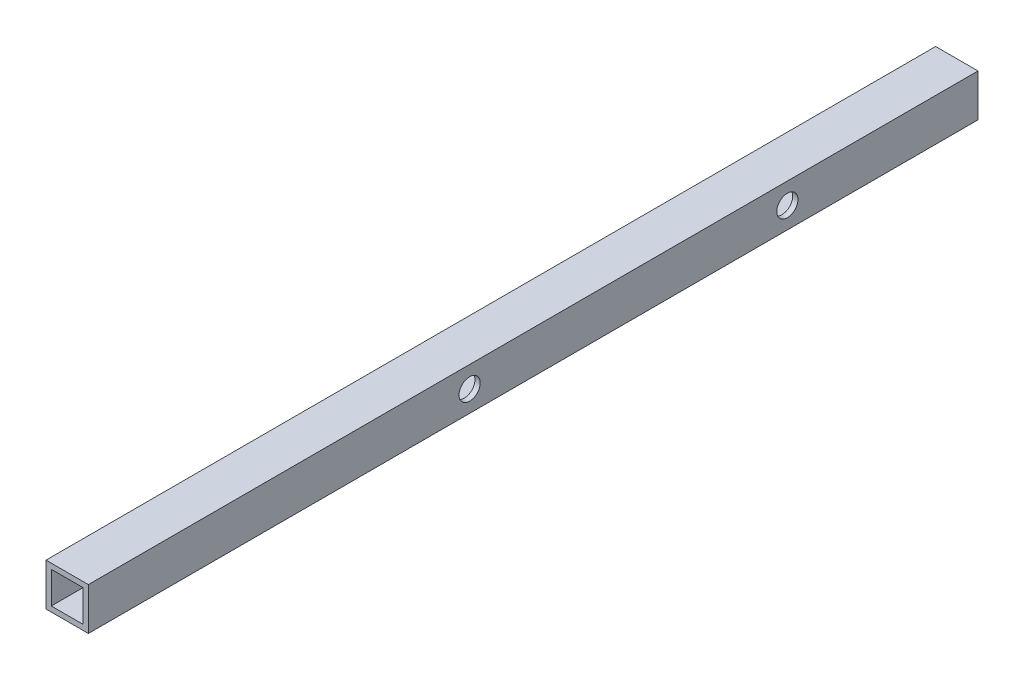
ISO-10303-21;
HEADER;
FILE_DESCRIPTION(('STEP AP214'),'2;1');
FILE_NAME('part.step','',(''),(''),'','','');
FILE_SCHEMA(('AUTOMOTIVE_DESIGN { 1 0 10303 214 1 1 1 1 }'));
ENDSEC;
DATA;
#1=APPLICATION_CONTEXT('core data for automotive mechanical design processes');
#2=APPLICATION_PROTOCOL_DEFINITION('international standard','automotive_design',2000,#1);
#3=PRODUCT_CONTEXT('',#1,'mechanical');
#4=PRODUCT('Part','Part','',(#3));
#5=PRODUCT_RELATED_PRODUCT_CATEGORY('part','',(#4));
#6=PRODUCT_DEFINITION_FORMATION('','',#4);
#7=PRODUCT_DEFINITION_CONTEXT('part definition',#1,'design');
#8=PRODUCT_DEFINITION('design','',#6,#7);
#9=PRODUCT_DEFINITION_SHAPE('','',#8);
#10=(LENGTH_UNIT() NAMED_UNIT(*) SI_UNIT(.MILLI.,.METRE.));
#11=(NAMED_UNIT(*) PLANE_ANGLE_UNIT() SI_UNIT($,.RADIAN.));
#12=(NAMED_UNIT(*) SI_UNIT($,.STERADIAN.) SOLID_ANGLE_UNIT());
#13=UNCERTAINTY_MEASURE_WITH_UNIT(LENGTH_MEASURE(1.E-05),#10,'distance_accuracy_value','');
#14=(GEOMETRIC_REPRESENTATION_CONTEXT(3) GLOBAL_UNCERTAINTY_ASSIGNED_CONTEXT((#13)) GLOBAL_UNIT_ASSIGNED_CONTEXT((#10,
#11,#12)) REPRESENTATION_CONTEXT('',''));
#15=CARTESIAN_POINT('',(0.,0.,0.));
#16=DIRECTION('',(0.,0.,1.));
#17=DIRECTION('',(1.,0.,0.));
#18=AXIS2_PLACEMENT_3D('',#15,#16,#17);
#19=CARTESIAN_POINT('',(0.,0.,533.4));
#20=DIRECTION('',(0.,0.,1.));
#21=DIRECTION('',(1.,0.,0.));
#22=AXIS2_PLACEMENT_3D('',#19,#20,#21);
#23=PLANE('',#22);
#24=DIRECTION('',(0.,1.,0.));
#25=VECTOR('',#24,1.);
#26=CARTESIAN_POINT('',(12.7,-12.7,533.4));
#27=LINE('',#26,#25);
#28=CARTESIAN_POINT('',(12.7,-12.7,533.4));
#29=VERTEX_POINT('',#28);
#30=CARTESIAN_POINT('',(12.7,12.7,533.4));
#31=VERTEX_POINT('',#30);
#32=EDGE_CURVE('E181',#29,#31,#27,.T.);
#33=ORIENTED_EDGE('',*,*,#32,.T.);
#34=DIRECTION('',(-1.,0.,0.));
#35=VECTOR('',#34,1.);
#36=CARTESIAN_POINT('',(-12.7,12.7,533.4));
#37=LINE('',#36,#35);
#38=CARTESIAN_POINT('',(-12.7,12.7,533.4));
#39=VERTEX_POINT('',#38);
#40=EDGE_CURVE('E185',#31,#39,#37,.T.);
#41=ORIENTED_EDGE('',*,*,#40,.T.);
#42=DIRECTION('',(0.,-1.,0.));
#43=VECTOR('',#42,1.);
#44=CARTESIAN_POINT('',(-12.7,-12.7,533.4));
#45=LINE('',#44,#43);
#46=CARTESIAN_POINT('',(-12.7,-12.7,533.4));
#47=VERTEX_POINT('',#46);
#48=EDGE_CURVE('E189',#39,#47,#45,.T.);
#49=ORIENTED_EDGE('',*,*,#48,.T.);
#50=DIRECTION('',(1.,0.,0.));
#51=VECTOR('',#50,1.);
#52=CARTESIAN_POINT('',(-12.7,-12.7,533.4));
#53=LINE('',#52,#51);
#54=EDGE_CURVE('E192',#47,#29,#53,.T.);
#55=ORIENTED_EDGE('',*,*,#54,.T.);
#56=EDGE_LOOP('',(#33,#41,#49,#55));
#57=FACE_BOUND('',#56,.T.);
#58=DIRECTION('',(-1.,0.,0.));
#59=VECTOR('',#58,1.);
#60=CARTESIAN_POINT('',(0.,9.525,533.4));
#61=LINE('',#60,#59);
#62=CARTESIAN_POINT('',(9.525,9.525,533.4));
#63=VERTEX_POINT('',#62);
#64=CARTESIAN_POINT('',(-9.525,9.525,533.4));
#65=VERTEX_POINT('',#64);
#66=EDGE_CURVE('E140',#63,#65,#61,.T.);
#67=ORIENTED_EDGE('',*,*,#66,.F.);
#68=DIRECTION('',(0.,1.,0.));
#69=VECTOR('',#68,1.);
#70=CARTESIAN_POINT('',(9.525,0.,533.4));
#71=LINE('',#70,#69);
#72=CARTESIAN_POINT('',(9.525,-9.525,533.4));
#73=VERTEX_POINT('',#72);
#74=EDGE_CURVE('E131',#73,#63,#71,.T.);
#75=ORIENTED_EDGE('',*,*,#74,.F.);
#76=DIRECTION('',(1.,0.,0.));
#77=VECTOR('',#76,1.);
#78=CARTESIAN_POINT('',(0.,-9.525,533.4));
#79=LINE('',#78,#77);
#80=CARTESIAN_POINT('',(-9.525,-9.525,533.4));
#81=VERTEX_POINT('',#80);
#82=EDGE_CURVE('E157',#81,#73,#79,.T.);
#83=ORIENTED_EDGE('',*,*,#82,.F.);
#84=DIRECTION('',(0.,-1.,0.));
#85=VECTOR('',#84,1.);
#86=CARTESIAN_POINT('',(-9.525,0.,533.4));
#87=LINE('',#86,#85);
#88=EDGE_CURVE('E153',#65,#81,#87,.T.);
#89=ORIENTED_EDGE('',*,*,#88,.F.);
#90=EDGE_LOOP('',(#67,#75,#83,#89));
#91=FACE_BOUND('',#90,.T.);
#92=ADVANCED_FACE('F63',(#57,#91),#23,.T.);
#93=CARTESIAN_POINT('',(0.,0.,0.));
#94=DIRECTION('',(0.,0.,1.));
#95=DIRECTION('',(1.,0.,0.));
#96=AXIS2_PLACEMENT_3D('',#93,#94,#95);
#97=PLANE('',#96);
#98=DIRECTION('',(0.,1.,0.));
#99=VECTOR('',#98,1.);
#100=CARTESIAN_POINT('',(12.7,-12.7,0.));
#101=LINE('',#100,#99);
#102=CARTESIAN_POINT('',(12.7,-12.7,0.));
#103=VERTEX_POINT('',#102);
#104=CARTESIAN_POINT('',(12.7,12.7,0.));
#105=VERTEX_POINT('',#104);
#106=EDGE_CURVE('E149',#103,#105,#101,.T.);
#107=ORIENTED_EDGE('',*,*,#106,.F.);
#108=DIRECTION('',(1.,0.,0.));
#109=VECTOR('',#108,1.);
#110=CARTESIAN_POINT('',(-12.7,-12.7,0.));
#111=LINE('',#110,#109);
#112=CARTESIAN_POINT('',(-12.7,-12.7,0.));
#113=VERTEX_POINT('',#112);
#114=EDGE_CURVE('E186',#113,#103,#111,.T.);
#115=ORIENTED_EDGE('',*,*,#114,.F.);
#116=DIRECTION('',(0.,-1.,0.));
#117=VECTOR('',#116,1.);
#118=CARTESIAN_POINT('',(-12.7,-12.7,0.));
#119=LINE('',#118,#117);
#120=CARTESIAN_POINT('',(-12.7,12.7,0.));
#121=VERTEX_POINT('',#120);
#122=EDGE_CURVE('E202',#121,#113,#119,.T.);
#123=ORIENTED_EDGE('',*,*,#122,.F.);
#124=DIRECTION('',(-1.,0.,0.));
#125=VECTOR('',#124,1.);
#126=CARTESIAN_POINT('',(-12.7,12.7,0.));
#127=LINE('',#126,#125);
#128=EDGE_CURVE('E199',#105,#121,#127,.T.);
#129=ORIENTED_EDGE('',*,*,#128,.F.);
#130=EDGE_LOOP('',(#107,#115,#123,#129));
#131=FACE_BOUND('',#130,.T.);
#132=DIRECTION('',(0.,1.,0.));
#133=VECTOR('',#132,1.);
#134=CARTESIAN_POINT('',(9.525,0.,0.));
#135=LINE('',#134,#133);
#136=CARTESIAN_POINT('',(9.525,-9.525,0.));
#137=VERTEX_POINT('',#136);
#138=CARTESIAN_POINT('',(9.525,9.525,0.));
#139=VERTEX_POINT('',#138);
#140=EDGE_CURVE('E89',#137,#139,#135,.T.);
#141=ORIENTED_EDGE('',*,*,#140,.T.);
#142=DIRECTION('',(-1.,0.,0.));
#143=VECTOR('',#142,1.);
#144=CARTESIAN_POINT('',(0.,9.525,0.));
#145=LINE('',#144,#143);
#146=CARTESIAN_POINT('',(-9.525,9.525,0.));
#147=VERTEX_POINT('',#146);
#148=EDGE_CURVE('E147',#139,#147,#145,.T.);
#149=ORIENTED_EDGE('',*,*,#148,.T.);
#150=DIRECTION('',(0.,-1.,0.));
#151=VECTOR('',#150,1.);
#152=CARTESIAN_POINT('',(-9.525,0.,0.));
#153=LINE('',#152,#151);
#154=CARTESIAN_POINT('',(-9.525,-9.525,0.));
#155=VERTEX_POINT('',#154);
#156=EDGE_CURVE('E168',#147,#155,#153,.T.);
#157=ORIENTED_EDGE('',*,*,#156,.T.);
#158=DIRECTION('',(1.,0.,0.));
#159=VECTOR('',#158,1.);
#160=CARTESIAN_POINT('',(0.,-9.525,0.));
#161=LINE('',#160,#159);
#162=EDGE_CURVE('E141',#155,#137,#161,.T.);
#163=ORIENTED_EDGE('',*,*,#162,.T.);
#164=EDGE_LOOP('',(#141,#149,#157,#163));
#165=FACE_BOUND('',#164,.T.);
#166=ADVANCED_FACE('F262',(#131,#165),#97,.F.);
#167=CARTESIAN_POINT('',(12.7,-12.7,533.4));
#168=DIRECTION('',(-1.,0.,0.));
#169=DIRECTION('',(0.,0.,1.));
#170=AXIS2_PLACEMENT_3D('',#167,#168,#169);
#171=PLANE('',#170);
#172=CARTESIAN_POINT('',(12.7,0.,304.8));
#173=DIRECTION('',(1.,0.,0.));
#174=DIRECTION('',(0.,0.,-1.));
#175=AXIS2_PLACEMENT_3D('',#172,#173,#174);
#176=CIRCLE('',#175,6.35);
#177=CARTESIAN_POINT('',(12.7,0.,298.45));
#178=VERTEX_POINT('',#177);
#179=EDGE_CURVE('E228',#178,#178,#176,.T.);
#180=ORIENTED_EDGE('',*,*,#179,.F.);
#181=EDGE_LOOP('',(#180));
#182=FACE_BOUND('',#181,.T.);
#183=CARTESIAN_POINT('',(12.7,0.,114.3));
#184=DIRECTION('',(1.,0.,0.));
#185=DIRECTION('',(0.,0.,-1.));
#186=AXIS2_PLACEMENT_3D('',#183,#184,#185);
#187=CIRCLE('',#186,6.35);
#188=CARTESIAN_POINT('',(12.7,0.,107.95));
#189=VERTEX_POINT('',#188);
#190=EDGE_CURVE('E240',#189,#189,#187,.T.);
#191=ORIENTED_EDGE('',*,*,#190,.F.);
#192=EDGE_LOOP('',(#191));
#193=FACE_BOUND('',#192,.T.);
#194=ORIENTED_EDGE('',*,*,#106,.T.);
#195=DIRECTION('',(0.,0.,-1.));
#196=VECTOR('',#195,1.);
#197=CARTESIAN_POINT('',(12.7,12.7,533.4));
#198=LINE('',#197,#196);
#199=EDGE_CURVE('E12',#31,#105,#198,.T.);
#200=ORIENTED_EDGE('',*,*,#199,.F.);
#201=ORIENTED_EDGE('',*,*,#32,.F.);
#202=DIRECTION('',(0.,0.,-1.));
#203=VECTOR('',#202,1.);
#204=CARTESIAN_POINT('',(12.7,-12.7,533.4));
#205=LINE('',#204,#203);
#206=EDGE_CURVE('E195',#29,#103,#205,.T.);
#207=ORIENTED_EDGE('',*,*,#206,.T.);
#208=EDGE_LOOP('',(#194,#200,#201,#207));
#209=FACE_BOUND('',#208,.T.);
#210=ADVANCED_FACE('F65',(#182,#193,#209),#171,.F.);
#211=CARTESIAN_POINT('',(-12.7,12.7,533.4));
#212=DIRECTION('',(0.,-1.,0.));
#213=DIRECTION('',(0.,0.,-1.));
#214=AXIS2_PLACEMENT_3D('',#211,#212,#213);
#215=PLANE('',#214);
#216=ORIENTED_EDGE('',*,*,#128,.T.);
#217=DIRECTION('',(0.,0.,-1.));
#218=VECTOR('',#217,1.);
#219=CARTESIAN_POINT('',(-12.7,12.7,533.4));
#220=LINE('',#219,#218);
#221=EDGE_CURVE('E73',#39,#121,#220,.T.);
#222=ORIENTED_EDGE('',*,*,#221,.F.);
#223=ORIENTED_EDGE('',*,*,#40,.F.);
#224=ORIENTED_EDGE('',*,*,#199,.T.);
#225=EDGE_LOOP('',(#216,#222,#223,#224));
#226=FACE_BOUND('',#225,.T.);
#227=ADVANCED_FACE('F288',(#226),#215,.F.);
#228=CARTESIAN_POINT('',(-12.7,-12.7,533.4));
#229=DIRECTION('',(1.,0.,0.));
#230=DIRECTION('',(0.,0.,-1.));
#231=AXIS2_PLACEMENT_3D('',#228,#229,#230);
#232=PLANE('',#231);
#233=CARTESIAN_POINT('',(-12.7,0.,304.8));
#234=DIRECTION('',(1.,0.,0.));
#235=DIRECTION('',(0.,0.,-1.));
#236=AXIS2_PLACEMENT_3D('',#233,#234,#235);
#237=CIRCLE('',#236,6.35);
#238=CARTESIAN_POINT('',(-12.7,0.,298.45));
#239=VERTEX_POINT('',#238);
#240=EDGE_CURVE('E220',#239,#239,#237,.T.);
#241=ORIENTED_EDGE('',*,*,#240,.T.);
#242=EDGE_LOOP('',(#241));
#243=FACE_BOUND('',#242,.T.);
#244=CARTESIAN_POINT('',(-12.7,0.,114.3));
#245=DIRECTION('',(1.,0.,0.));
#246=DIRECTION('',(0.,0.,-1.));
#247=AXIS2_PLACEMENT_3D('',#244,#245,#246);
#248=CIRCLE('',#247,6.35);
#249=CARTESIAN_POINT('',(-12.7,0.,107.95));
#250=VERTEX_POINT('',#249);
#251=EDGE_CURVE('E234',#250,#250,#248,.T.);
#252=ORIENTED_EDGE('',*,*,#251,.T.);
#253=EDGE_LOOP('',(#252));
#254=FACE_BOUND('',#253,.T.);
#255=ORIENTED_EDGE('',*,*,#122,.T.);
#256=DIRECTION('',(0.,0.,-1.));
#257=VECTOR('',#256,1.);
#258=CARTESIAN_POINT('',(-12.7,-12.7,533.4));
#259=LINE('',#258,#257);
#260=EDGE_CURVE('E210',#47,#113,#259,.T.);
#261=ORIENTED_EDGE('',*,*,#260,.F.);
#262=ORIENTED_EDGE('',*,*,#48,.F.);
#263=ORIENTED_EDGE('',*,*,#221,.T.);
#264=EDGE_LOOP('',(#255,#261,#262,#263));
#265=FACE_BOUND('',#264,.T.);
#266=ADVANCED_FACE('F285',(#243,#254,#265),#232,.F.);
#267=CARTESIAN_POINT('',(-12.7,-12.7,533.4));
#268=DIRECTION('',(0.,1.,0.));
#269=DIRECTION('',(0.,0.,1.));
#270=AXIS2_PLACEMENT_3D('',#267,#268,#269);
#271=PLANE('',#270);
#272=ORIENTED_EDGE('',*,*,#114,.T.);
#273=ORIENTED_EDGE('',*,*,#206,.F.);
#274=ORIENTED_EDGE('',*,*,#54,.F.);
#275=ORIENTED_EDGE('',*,*,#260,.T.);
#276=EDGE_LOOP('',(#272,#273,#274,#275));
#277=FACE_BOUND('',#276,.T.);
#278=ADVANCED_FACE('F282',(#277),#271,.F.);
#279=CARTESIAN_POINT('',(9.525,0.,533.4));
#280=DIRECTION('',(-1.,0.,0.));
#281=DIRECTION('',(0.,0.,1.));
#282=AXIS2_PLACEMENT_3D('',#279,#280,#281);
#283=PLANE('',#282);
#284=CARTESIAN_POINT('',(9.525,0.,304.8));
#285=DIRECTION('',(-1.,0.,0.));
#286=DIRECTION('',(0.,0.,1.));
#287=AXIS2_PLACEMENT_3D('',#284,#285,#286);
#288=CIRCLE('',#287,6.35);
#289=CARTESIAN_POINT('',(9.525,0.,311.15));
#290=VERTEX_POINT('',#289);
#291=EDGE_CURVE('E165',#290,#290,#288,.T.);
#292=ORIENTED_EDGE('',*,*,#291,.F.);
#293=EDGE_LOOP('',(#292));
#294=FACE_BOUND('',#293,.T.);
#295=CARTESIAN_POINT('',(9.525,0.,114.3));
#296=DIRECTION('',(-1.,0.,0.));
#297=DIRECTION('',(0.,0.,1.));
#298=AXIS2_PLACEMENT_3D('',#295,#296,#297);
#299=CIRCLE('',#298,6.35);
#300=CARTESIAN_POINT('',(9.525,0.,120.65));
#301=VERTEX_POINT('',#300);
#302=EDGE_CURVE('E219',#301,#301,#299,.T.);
#303=ORIENTED_EDGE('',*,*,#302,.F.);
#304=EDGE_LOOP('',(#303));
#305=FACE_BOUND('',#304,.T.);
#306=ORIENTED_EDGE('',*,*,#140,.F.);
#307=DIRECTION('',(0.,0.,-1.));
#308=VECTOR('',#307,1.);
#309=CARTESIAN_POINT('',(9.525,-9.525,533.4));
#310=LINE('',#309,#308);
#311=EDGE_CURVE('E135',#73,#137,#310,.T.);
#312=ORIENTED_EDGE('',*,*,#311,.F.);
#313=ORIENTED_EDGE('',*,*,#74,.T.);
#314=DIRECTION('',(0.,0.,-1.));
#315=VECTOR('',#314,1.);
#316=CARTESIAN_POINT('',(9.525,9.525,533.4));
#317=LINE('',#316,#315);
#318=EDGE_CURVE('E134',#63,#139,#317,.T.);
#319=ORIENTED_EDGE('',*,*,#318,.T.);
#320=EDGE_LOOP('',(#306,#312,#313,#319));
#321=FACE_BOUND('',#320,.T.);
#322=ADVANCED_FACE('F133',(#294,#305,#321),#283,.T.);
#323=CARTESIAN_POINT('',(0.,9.525,533.4));
#324=DIRECTION('',(0.,-1.,0.));
#325=DIRECTION('',(0.,0.,-1.));
#326=AXIS2_PLACEMENT_3D('',#323,#324,#325);
#327=PLANE('',#326);
#328=ORIENTED_EDGE('',*,*,#148,.F.);
#329=ORIENTED_EDGE('',*,*,#318,.F.);
#330=ORIENTED_EDGE('',*,*,#66,.T.);
#331=DIRECTION('',(0.,0.,-1.));
#332=VECTOR('',#331,1.);
#333=CARTESIAN_POINT('',(-9.525,9.525,533.4));
#334=LINE('',#333,#332);
#335=EDGE_CURVE('E150',#65,#147,#334,.T.);
#336=ORIENTED_EDGE('',*,*,#335,.T.);
#337=EDGE_LOOP('',(#328,#329,#330,#336));
#338=FACE_BOUND('',#337,.T.);
#339=ADVANCED_FACE('F144',(#338),#327,.T.);
#340=CARTESIAN_POINT('',(-9.525,0.,533.4));
#341=DIRECTION('',(1.,0.,0.));
#342=DIRECTION('',(0.,0.,-1.));
#343=AXIS2_PLACEMENT_3D('',#340,#341,#342);
#344=PLANE('',#343);
#345=CARTESIAN_POINT('',(-9.525,0.,304.8));
#346=DIRECTION('',(1.,0.,0.));
#347=DIRECTION('',(0.,0.,-1.));
#348=AXIS2_PLACEMENT_3D('',#345,#346,#347);
#349=CIRCLE('',#348,6.35);
#350=CARTESIAN_POINT('',(-9.525,0.,298.45));
#351=VERTEX_POINT('',#350);
#352=EDGE_CURVE('E67',#351,#351,#349,.T.);
#353=ORIENTED_EDGE('',*,*,#352,.F.);
#354=EDGE_LOOP('',(#353));
#355=FACE_BOUND('',#354,.T.);
#356=CARTESIAN_POINT('',(-9.525,0.,114.3));
#357=DIRECTION('',(1.,0.,0.));
#358=DIRECTION('',(0.,0.,-1.));
#359=AXIS2_PLACEMENT_3D('',#356,#357,#358);
#360=CIRCLE('',#359,6.35);
#361=CARTESIAN_POINT('',(-9.525,0.,107.95));
#362=VERTEX_POINT('',#361);
#363=EDGE_CURVE('E216',#362,#362,#360,.T.);
#364=ORIENTED_EDGE('',*,*,#363,.F.);
#365=EDGE_LOOP('',(#364));
#366=FACE_BOUND('',#365,.T.);
#367=ORIENTED_EDGE('',*,*,#156,.F.);
#368=ORIENTED_EDGE('',*,*,#335,.F.);
#369=ORIENTED_EDGE('',*,*,#88,.T.);
#370=DIRECTION('',(0.,0.,-1.));
#371=VECTOR('',#370,1.);
#372=CARTESIAN_POINT('',(-9.525,-9.525,533.4));
#373=LINE('',#372,#371);
#374=EDGE_CURVE('E81',#81,#155,#373,.T.);
#375=ORIENTED_EDGE('',*,*,#374,.T.);
#376=EDGE_LOOP('',(#367,#368,#369,#375));
#377=FACE_BOUND('',#376,.T.);
#378=ADVANCED_FACE('F254',(#355,#366,#377),#344,.T.);
#379=CARTESIAN_POINT('',(0.,-9.525,533.4));
#380=DIRECTION('',(0.,1.,0.));
#381=DIRECTION('',(0.,0.,1.));
#382=AXIS2_PLACEMENT_3D('',#379,#380,#381);
#383=PLANE('',#382);
#384=ORIENTED_EDGE('',*,*,#162,.F.);
#385=ORIENTED_EDGE('',*,*,#374,.F.);
#386=ORIENTED_EDGE('',*,*,#82,.T.);
#387=ORIENTED_EDGE('',*,*,#311,.T.);
#388=EDGE_LOOP('',(#384,#385,#386,#387));
#389=FACE_BOUND('',#388,.T.);
#390=ADVANCED_FACE('F257',(#389),#383,.T.);
#391=CARTESIAN_POINT('',(-12.7,0.,114.3));
#392=DIRECTION('',(1.,0.,0.));
#393=DIRECTION('',(0.,0.,-1.));
#394=AXIS2_PLACEMENT_3D('',#391,#392,#393);
#395=CYLINDRICAL_SURFACE('',#394,6.35);
#396=ORIENTED_EDGE('',*,*,#363,.T.);
#397=EDGE_LOOP('',(#396));
#398=FACE_BOUND('',#397,.T.);
#399=ORIENTED_EDGE('',*,*,#251,.F.);
#400=EDGE_LOOP('',(#399));
#401=FACE_BOUND('',#400,.T.);
#402=ADVANCED_FACE('F264',(#398,#401),#395,.F.);
#403=CARTESIAN_POINT('',(-12.7,0.,304.8));
#404=DIRECTION('',(1.,0.,0.));
#405=DIRECTION('',(0.,0.,-1.));
#406=AXIS2_PLACEMENT_3D('',#403,#404,#405);
#407=CYLINDRICAL_SURFACE('',#406,6.35);
#408=ORIENTED_EDGE('',*,*,#352,.T.);
#409=EDGE_LOOP('',(#408));
#410=FACE_BOUND('',#409,.T.);
#411=ORIENTED_EDGE('',*,*,#240,.F.);
#412=EDGE_LOOP('',(#411));
#413=FACE_BOUND('',#412,.T.);
#414=ADVANCED_FACE('F251',(#410,#413),#407,.F.);
#415=ORIENTED_EDGE('',*,*,#302,.T.);
#416=EDGE_LOOP('',(#415));
#417=FACE_BOUND('',#416,.T.);
#418=ORIENTED_EDGE('',*,*,#190,.T.);
#419=EDGE_LOOP('',(#418));
#420=FACE_BOUND('',#419,.T.);
#421=ADVANCED_FACE('F270',(#417,#420),#395,.F.);
#422=ORIENTED_EDGE('',*,*,#291,.T.);
#423=EDGE_LOOP('',(#422));
#424=FACE_BOUND('',#423,.T.);
#425=ORIENTED_EDGE('',*,*,#179,.T.);
#426=EDGE_LOOP('',(#425));
#427=FACE_BOUND('',#426,.T.);
#428=ADVANCED_FACE('F314',(#424,#427),#407,.F.);
#429=CLOSED_SHELL('',(#92,#166,#210,#227,#266,#278,#322,#339,#378,#390,#402,#414,#421,#428));
#430=MANIFOLD_SOLID_BREP('B2',#429);
#431=ADVANCED_BREP_SHAPE_REPRESENTATION('',(#18,#430),#14);
#432=SHAPE_DEFINITION_REPRESENTATION(#9,#431);
ENDSEC;
END-ISO-10303-21;
